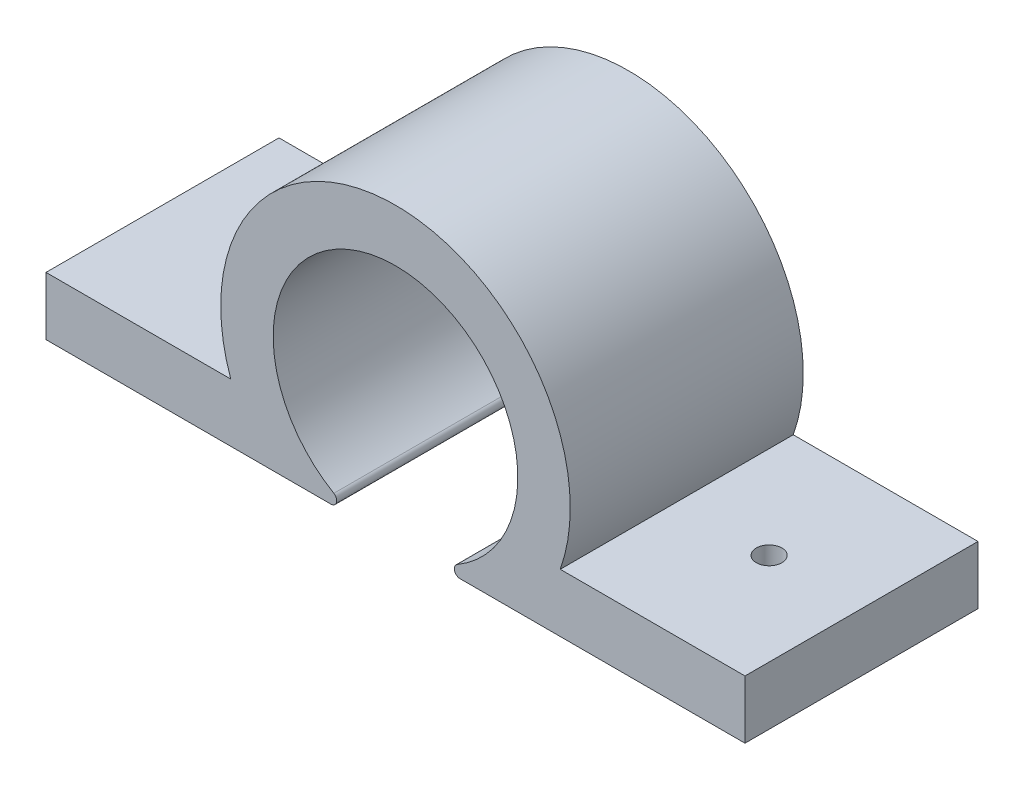
ISO-10303-21;
HEADER;
FILE_DESCRIPTION(('STEP AP214'),'2;1');
FILE_NAME('part.step','',(''),(''),'','','');
FILE_SCHEMA(('AUTOMOTIVE_DESIGN { 1 0 10303 214 1 1 1 1 }'));
ENDSEC;
DATA;
#1=APPLICATION_CONTEXT('core data for automotive mechanical design processes');
#2=APPLICATION_PROTOCOL_DEFINITION('international standard','automotive_design',2000,#1);
#3=PRODUCT_CONTEXT('',#1,'mechanical');
#4=PRODUCT('Part','Part','',(#3));
#5=PRODUCT_RELATED_PRODUCT_CATEGORY('part','',(#4));
#6=PRODUCT_DEFINITION_FORMATION('','',#4);
#7=PRODUCT_DEFINITION_CONTEXT('part definition',#1,'design');
#8=PRODUCT_DEFINITION('design','',#6,#7);
#9=PRODUCT_DEFINITION_SHAPE('','',#8);
#10=(LENGTH_UNIT() NAMED_UNIT(*) SI_UNIT(.MILLI.,.METRE.));
#11=(NAMED_UNIT(*) PLANE_ANGLE_UNIT() SI_UNIT($,.RADIAN.));
#12=(NAMED_UNIT(*) SI_UNIT($,.STERADIAN.) SOLID_ANGLE_UNIT());
#13=UNCERTAINTY_MEASURE_WITH_UNIT(LENGTH_MEASURE(1.E-05),#10,'distance_accuracy_value','');
#14=(GEOMETRIC_REPRESENTATION_CONTEXT(3) GLOBAL_UNCERTAINTY_ASSIGNED_CONTEXT((#13)) GLOBAL_UNIT_ASSIGNED_CONTEXT((#10,
#11,#12)) REPRESENTATION_CONTEXT('',''));
#15=CARTESIAN_POINT('',(0.,0.,0.));
#16=DIRECTION('',(0.,0.,1.));
#17=DIRECTION('',(1.,0.,0.));
#18=AXIS2_PLACEMENT_3D('',#15,#16,#17);
#19=CARTESIAN_POINT('',(-30.,-2.5,20.));
#20=DIRECTION('',(0.,1.,0.));
#21=DIRECTION('',(0.,0.,1.));
#22=AXIS2_PLACEMENT_3D('',#19,#20,#21);
#23=PLANE('',#22);
#24=CARTESIAN_POINT('',(-22.0710678118655,-2.5,10.));
#25=DIRECTION('',(0.,1.,0.));
#26=DIRECTION('',(0.,0.,1.));
#27=AXIS2_PLACEMENT_3D('',#24,#25,#26);
#28=CIRCLE('',#27,1.1);
#29=CARTESIAN_POINT('',(-22.0710678118655,-2.5,11.1));
#30=VERTEX_POINT('',#29);
#31=EDGE_CURVE('E246',#30,#30,#28,.F.);
#32=ORIENTED_EDGE('',*,*,#31,.F.);
#33=EDGE_LOOP('',(#32));
#34=FACE_BOUND('',#33,.T.);
#35=DIRECTION('',(1.,0.,0.));
#36=VECTOR('',#35,1.);
#37=CARTESIAN_POINT('',(-30.,-2.5,0.));
#38=LINE('',#37,#36);
#39=CARTESIAN_POINT('',(-30.,-2.5,0.));
#40=VERTEX_POINT('',#39);
#41=CARTESIAN_POINT('',(-5.54526825320472,-2.5,0.));
#42=VERTEX_POINT('',#41);
#43=EDGE_CURVE('E137',#40,#42,#38,.T.);
#44=ORIENTED_EDGE('',*,*,#43,.T.);
#45=DIRECTION('',(0.,0.,1.));
#46=VECTOR('',#45,1.);
#47=CARTESIAN_POINT('',(-5.54526825320471,-2.5,20.));
#48=LINE('',#47,#46);
#49=CARTESIAN_POINT('',(-5.54526825320472,-2.5,20.));
#50=VERTEX_POINT('',#49);
#51=EDGE_CURVE('E11',#42,#50,#48,.T.);
#52=ORIENTED_EDGE('',*,*,#51,.T.);
#53=DIRECTION('',(1.,0.,0.));
#54=VECTOR('',#53,1.);
#55=CARTESIAN_POINT('',(-30.,-2.5,20.));
#56=LINE('',#55,#54);
#57=CARTESIAN_POINT('',(-30.,-2.5,20.));
#58=VERTEX_POINT('',#57);
#59=EDGE_CURVE('E181',#58,#50,#56,.T.);
#60=ORIENTED_EDGE('',*,*,#59,.F.);
#61=DIRECTION('',(0.,0.,-1.));
#62=VECTOR('',#61,1.);
#63=CARTESIAN_POINT('',(-30.,-2.5,20.));
#64=LINE('',#63,#62);
#65=EDGE_CURVE('E199',#58,#40,#64,.T.);
#66=ORIENTED_EDGE('',*,*,#65,.T.);
#67=EDGE_LOOP('',(#44,#52,#60,#66));
#68=FACE_BOUND('',#67,.T.);
#69=ADVANCED_FACE('F38',(#34,#68),#23,.F.);
#70=CARTESIAN_POINT('',(30.,2.5,20.));
#71=DIRECTION('',(-1.,0.,0.));
#72=DIRECTION('',(0.,-1.,0.));
#73=AXIS2_PLACEMENT_3D('',#70,#71,#72);
#74=PLANE('',#73);
#75=DIRECTION('',(0.,1.,0.));
#76=VECTOR('',#75,1.);
#77=CARTESIAN_POINT('',(30.,2.5,0.));
#78=LINE('',#77,#76);
#79=CARTESIAN_POINT('',(30.,-2.5,0.));
#80=VERTEX_POINT('',#79);
#81=CARTESIAN_POINT('',(30.,2.5,0.));
#82=VERTEX_POINT('',#81);
#83=EDGE_CURVE('E141',#80,#82,#78,.T.);
#84=ORIENTED_EDGE('',*,*,#83,.T.);
#85=DIRECTION('',(0.,0.,-1.));
#86=VECTOR('',#85,1.);
#87=CARTESIAN_POINT('',(30.,2.5,20.));
#88=LINE('',#87,#86);
#89=CARTESIAN_POINT('',(30.,2.5,20.));
#90=VERTEX_POINT('',#89);
#91=EDGE_CURVE('E120',#90,#82,#88,.T.);
#92=ORIENTED_EDGE('',*,*,#91,.F.);
#93=DIRECTION('',(0.,1.,0.));
#94=VECTOR('',#93,1.);
#95=CARTESIAN_POINT('',(30.,2.5,20.));
#96=LINE('',#95,#94);
#97=CARTESIAN_POINT('',(30.,-2.5,20.));
#98=VERTEX_POINT('',#97);
#99=EDGE_CURVE('E127',#98,#90,#96,.T.);
#100=ORIENTED_EDGE('',*,*,#99,.F.);
#101=DIRECTION('',(0.,0.,-1.));
#102=VECTOR('',#101,1.);
#103=CARTESIAN_POINT('',(30.,-2.5,20.));
#104=LINE('',#103,#102);
#105=EDGE_CURVE('E179',#98,#80,#104,.T.);
#106=ORIENTED_EDGE('',*,*,#105,.T.);
#107=EDGE_LOOP('',(#84,#92,#100,#106));
#108=FACE_BOUND('',#107,.T.);
#109=ADVANCED_FACE('F139',(#108),#74,.F.);
#110=CARTESIAN_POINT('',(14.142135623731,2.50000000000001,20.));
#111=DIRECTION('',(0.,-1.,0.));
#112=DIRECTION('',(1.,0.,0.));
#113=AXIS2_PLACEMENT_3D('',#110,#111,#112);
#114=PLANE('',#113);
#115=CARTESIAN_POINT('',(22.0710678118655,2.50000000000001,10.));
#116=DIRECTION('',(0.,1.,0.));
#117=DIRECTION('',(0.,0.,1.));
#118=AXIS2_PLACEMENT_3D('',#115,#116,#117);
#119=CIRCLE('',#118,1.1);
#120=CARTESIAN_POINT('',(22.0710678118655,2.50000000000001,11.1));
#121=VERTEX_POINT('',#120);
#122=EDGE_CURVE('E252',#121,#121,#119,.T.);
#123=ORIENTED_EDGE('',*,*,#122,.F.);
#124=EDGE_LOOP('',(#123));
#125=FACE_BOUND('',#124,.T.);
#126=DIRECTION('',(-1.,0.,0.));
#127=VECTOR('',#126,1.);
#128=CARTESIAN_POINT('',(14.142135623731,2.50000000000001,0.));
#129=LINE('',#128,#127);
#130=CARTESIAN_POINT('',(14.1421356237309,2.5,0.));
#131=VERTEX_POINT('',#130);
#132=EDGE_CURVE('E230',#82,#131,#129,.T.);
#133=ORIENTED_EDGE('',*,*,#132,.T.);
#134=DIRECTION('',(0.,0.,-1.));
#135=VECTOR('',#134,1.);
#136=CARTESIAN_POINT('',(14.1421356237309,2.5,20.));
#137=LINE('',#136,#135);
#138=CARTESIAN_POINT('',(14.1421356237309,2.5,20.));
#139=VERTEX_POINT('',#138);
#140=EDGE_CURVE('E123',#139,#131,#137,.T.);
#141=ORIENTED_EDGE('',*,*,#140,.F.);
#142=DIRECTION('',(-1.,0.,0.));
#143=VECTOR('',#142,1.);
#144=CARTESIAN_POINT('',(14.142135623731,2.50000000000001,20.));
#145=LINE('',#144,#143);
#146=EDGE_CURVE('E116',#90,#139,#145,.T.);
#147=ORIENTED_EDGE('',*,*,#146,.F.);
#148=ORIENTED_EDGE('',*,*,#91,.T.);
#149=EDGE_LOOP('',(#133,#141,#147,#148));
#150=FACE_BOUND('',#149,.T.);
#151=ADVANCED_FACE('F118',(#125,#150),#114,.F.);
#152=CARTESIAN_POINT('',(0.,7.5,20.));
#153=DIRECTION('',(0.,0.,-1.));
#154=DIRECTION('',(-1.,0.,0.));
#155=AXIS2_PLACEMENT_3D('',#152,#153,#154);
#156=CYLINDRICAL_SURFACE('',#155,15.);
#157=CARTESIAN_POINT('',(0.,7.5,0.));
#158=DIRECTION('',(0.,0.,1.));
#159=DIRECTION('',(1.,0.,0.));
#160=AXIS2_PLACEMENT_3D('',#157,#158,#159);
#161=CIRCLE('',#160,15.);
#162=CARTESIAN_POINT('',(-14.142135623731,2.50000000000001,0.));
#163=VERTEX_POINT('',#162);
#164=EDGE_CURVE('E226',#131,#163,#161,.T.);
#165=ORIENTED_EDGE('',*,*,#164,.T.);
#166=DIRECTION('',(0.,0.,-1.));
#167=VECTOR('',#166,1.);
#168=CARTESIAN_POINT('',(-14.142135623731,2.50000000000001,20.));
#169=LINE('',#168,#167);
#170=CARTESIAN_POINT('',(-14.142135623731,2.50000000000001,20.));
#171=VERTEX_POINT('',#170);
#172=EDGE_CURVE('E150',#171,#163,#169,.T.);
#173=ORIENTED_EDGE('',*,*,#172,.F.);
#174=CARTESIAN_POINT('',(0.,7.5,20.));
#175=DIRECTION('',(0.,0.,1.));
#176=DIRECTION('',(1.,0.,0.));
#177=AXIS2_PLACEMENT_3D('',#174,#175,#176);
#178=CIRCLE('',#177,15.);
#179=EDGE_CURVE('E126',#139,#171,#178,.T.);
#180=ORIENTED_EDGE('',*,*,#179,.F.);
#181=ORIENTED_EDGE('',*,*,#140,.T.);
#182=EDGE_LOOP('',(#165,#173,#180,#181));
#183=FACE_BOUND('',#182,.T.);
#184=ADVANCED_FACE('F267',(#183),#156,.T.);
#185=CARTESIAN_POINT('',(-30.,2.5,20.));
#186=DIRECTION('',(0.,-1.,0.));
#187=DIRECTION('',(1.,0.,0.));
#188=AXIS2_PLACEMENT_3D('',#185,#186,#187);
#189=PLANE('',#188);
#190=CARTESIAN_POINT('',(-22.0710678118655,2.50000000000001,10.));
#191=DIRECTION('',(0.,1.,0.));
#192=DIRECTION('',(0.,0.,1.));
#193=AXIS2_PLACEMENT_3D('',#190,#191,#192);
#194=CIRCLE('',#193,1.1);
#195=CARTESIAN_POINT('',(-22.0710678118655,2.50000000000001,11.1));
#196=VERTEX_POINT('',#195);
#197=EDGE_CURVE('E251',#196,#196,#194,.T.);
#198=ORIENTED_EDGE('',*,*,#197,.F.);
#199=EDGE_LOOP('',(#198));
#200=FACE_BOUND('',#199,.T.);
#201=DIRECTION('',(-1.,0.,0.));
#202=VECTOR('',#201,1.);
#203=CARTESIAN_POINT('',(-30.,2.5,0.));
#204=LINE('',#203,#202);
#205=CARTESIAN_POINT('',(-30.,2.5,0.));
#206=VERTEX_POINT('',#205);
#207=EDGE_CURVE('E222',#163,#206,#204,.T.);
#208=ORIENTED_EDGE('',*,*,#207,.T.);
#209=DIRECTION('',(0.,0.,-1.));
#210=VECTOR('',#209,1.);
#211=CARTESIAN_POINT('',(-30.,2.5,20.));
#212=LINE('',#211,#210);
#213=CARTESIAN_POINT('',(-30.,2.5,20.));
#214=VERTEX_POINT('',#213);
#215=EDGE_CURVE('E211',#214,#206,#212,.T.);
#216=ORIENTED_EDGE('',*,*,#215,.F.);
#217=DIRECTION('',(-1.,0.,0.));
#218=VECTOR('',#217,1.);
#219=CARTESIAN_POINT('',(-30.,2.5,20.));
#220=LINE('',#219,#218);
#221=EDGE_CURVE('E223',#171,#214,#220,.T.);
#222=ORIENTED_EDGE('',*,*,#221,.F.);
#223=ORIENTED_EDGE('',*,*,#172,.T.);
#224=EDGE_LOOP('',(#208,#216,#222,#223));
#225=FACE_BOUND('',#224,.T.);
#226=ADVANCED_FACE('F220',(#200,#225),#189,.F.);
#227=CARTESIAN_POINT('',(-30.,2.5,20.));
#228=DIRECTION('',(1.,0.,0.));
#229=DIRECTION('',(0.,1.,0.));
#230=AXIS2_PLACEMENT_3D('',#227,#228,#229);
#231=PLANE('',#230);
#232=DIRECTION('',(0.,-1.,0.));
#233=VECTOR('',#232,1.);
#234=CARTESIAN_POINT('',(-30.,2.5,0.));
#235=LINE('',#234,#233);
#236=EDGE_CURVE('E203',#206,#40,#235,.T.);
#237=ORIENTED_EDGE('',*,*,#236,.T.);
#238=ORIENTED_EDGE('',*,*,#65,.F.);
#239=DIRECTION('',(0.,-1.,0.));
#240=VECTOR('',#239,1.);
#241=CARTESIAN_POINT('',(-30.,2.5,20.));
#242=LINE('',#241,#240);
#243=EDGE_CURVE('E182',#214,#58,#242,.T.);
#244=ORIENTED_EDGE('',*,*,#243,.F.);
#245=ORIENTED_EDGE('',*,*,#215,.T.);
#246=EDGE_LOOP('',(#237,#238,#244,#245));
#247=FACE_BOUND('',#246,.T.);
#248=ADVANCED_FACE('F266',(#247),#231,.F.);
#249=CARTESIAN_POINT('',(22.0710678118655,-2.5,10.));
#250=DIRECTION('',(0.,1.,0.));
#251=DIRECTION('',(0.,0.,1.));
#252=AXIS2_PLACEMENT_3D('',#249,#250,#251);
#253=CIRCLE('',#252,1.1);
#254=CARTESIAN_POINT('',(22.0710678118655,-2.5,11.1));
#255=VERTEX_POINT('',#254);
#256=EDGE_CURVE('E247',#255,#255,#253,.F.);
#257=ORIENTED_EDGE('',*,*,#256,.F.);
#258=EDGE_LOOP('',(#257));
#259=FACE_BOUND('',#258,.T.);
#260=CARTESIAN_POINT('',(5.5452682532047,-2.5,20.));
#261=VERTEX_POINT('',#260);
#262=EDGE_CURVE('E132',#261,#98,#56,.T.);
#263=ORIENTED_EDGE('',*,*,#262,.F.);
#264=DIRECTION('',(0.,0.,1.));
#265=VECTOR('',#264,1.);
#266=CARTESIAN_POINT('',(5.54526825320471,-2.5,20.));
#267=LINE('',#266,#265);
#268=CARTESIAN_POINT('',(5.5452682532047,-2.5,0.));
#269=VERTEX_POINT('',#268);
#270=EDGE_CURVE('E148',#261,#269,#267,.F.);
#271=ORIENTED_EDGE('',*,*,#270,.T.);
#272=EDGE_CURVE('E189',#269,#80,#38,.T.);
#273=ORIENTED_EDGE('',*,*,#272,.T.);
#274=ORIENTED_EDGE('',*,*,#105,.F.);
#275=EDGE_LOOP('',(#263,#271,#273,#274));
#276=FACE_BOUND('',#275,.T.);
#277=ADVANCED_FACE('F177',(#259,#276),#23,.F.);
#278=CARTESIAN_POINT('',(0.,7.5,20.));
#279=DIRECTION('',(0.,0.,1.));
#280=DIRECTION('',(1.,0.,0.));
#281=AXIS2_PLACEMENT_3D('',#278,#279,#280);
#282=PLANE('',#281);
#283=CARTESIAN_POINT('',(0.,7.5,20.));
#284=DIRECTION('',(0.,0.,1.));
#285=DIRECTION('',(1.,0.,0.));
#286=AXIS2_PLACEMENT_3D('',#283,#284,#285);
#287=CIRCLE('',#286,10.5);
#288=CARTESIAN_POINT('',(5.29321060533177,-1.56818181818182,20.));
#289=VERTEX_POINT('',#288);
#290=CARTESIAN_POINT('',(-5.29321060533177,-1.56818181818182,20.));
#291=VERTEX_POINT('',#290);
#292=EDGE_CURVE('E172',#289,#291,#287,.T.);
#293=ORIENTED_EDGE('',*,*,#292,.F.);
#294=CARTESIAN_POINT('',(5.54526825320471,-2.,20.));
#295=DIRECTION('',(0.,0.,1.));
#296=DIRECTION('',(1.,0.,0.));
#297=AXIS2_PLACEMENT_3D('',#294,#295,#296);
#298=CIRCLE('',#297,0.5);
#299=EDGE_CURVE('E47',#289,#261,#298,.T.);
#300=ORIENTED_EDGE('',*,*,#299,.T.);
#301=ORIENTED_EDGE('',*,*,#262,.T.);
#302=ORIENTED_EDGE('',*,*,#99,.T.);
#303=ORIENTED_EDGE('',*,*,#146,.T.);
#304=ORIENTED_EDGE('',*,*,#179,.T.);
#305=ORIENTED_EDGE('',*,*,#221,.T.);
#306=ORIENTED_EDGE('',*,*,#243,.T.);
#307=ORIENTED_EDGE('',*,*,#59,.T.);
#308=CARTESIAN_POINT('',(-5.54526825320471,-2.,20.));
#309=DIRECTION('',(0.,0.,1.));
#310=DIRECTION('',(1.,0.,0.));
#311=AXIS2_PLACEMENT_3D('',#308,#309,#310);
#312=CIRCLE('',#311,0.5);
#313=EDGE_CURVE('E54',#50,#291,#312,.T.);
#314=ORIENTED_EDGE('',*,*,#313,.T.);
#315=EDGE_LOOP('',(#293,#300,#301,#302,#303,#304,#305,#306,#307,#314));
#316=FACE_BOUND('',#315,.T.);
#317=ADVANCED_FACE('F130',(#316),#282,.T.);
#318=CARTESIAN_POINT('',(0.,7.5,0.));
#319=DIRECTION('',(0.,0.,1.));
#320=DIRECTION('',(1.,0.,0.));
#321=AXIS2_PLACEMENT_3D('',#318,#319,#320);
#322=PLANE('',#321);
#323=ORIENTED_EDGE('',*,*,#272,.F.);
#324=CARTESIAN_POINT('',(5.54526825320471,-2.,0.));
#325=DIRECTION('',(0.,0.,1.));
#326=DIRECTION('',(1.,0.,0.));
#327=AXIS2_PLACEMENT_3D('',#324,#325,#326);
#328=CIRCLE('',#327,0.5);
#329=CARTESIAN_POINT('',(5.29321060533177,-1.56818181818182,0.));
#330=VERTEX_POINT('',#329);
#331=EDGE_CURVE('E160',#269,#330,#328,.F.);
#332=ORIENTED_EDGE('',*,*,#331,.T.);
#333=CARTESIAN_POINT('',(0.,7.5,0.));
#334=DIRECTION('',(0.,0.,1.));
#335=DIRECTION('',(1.,0.,0.));
#336=AXIS2_PLACEMENT_3D('',#333,#334,#335);
#337=CIRCLE('',#336,10.5);
#338=CARTESIAN_POINT('',(-5.29321060533177,-1.56818181818182,0.));
#339=VERTEX_POINT('',#338);
#340=EDGE_CURVE('E143',#330,#339,#337,.T.);
#341=ORIENTED_EDGE('',*,*,#340,.T.);
#342=CARTESIAN_POINT('',(-5.54526825320471,-2.,0.));
#343=DIRECTION('',(0.,0.,1.));
#344=DIRECTION('',(1.,0.,0.));
#345=AXIS2_PLACEMENT_3D('',#342,#343,#344);
#346=CIRCLE('',#345,0.5);
#347=EDGE_CURVE('E157',#339,#42,#346,.F.);
#348=ORIENTED_EDGE('',*,*,#347,.T.);
#349=ORIENTED_EDGE('',*,*,#43,.F.);
#350=ORIENTED_EDGE('',*,*,#236,.F.);
#351=ORIENTED_EDGE('',*,*,#207,.F.);
#352=ORIENTED_EDGE('',*,*,#164,.F.);
#353=ORIENTED_EDGE('',*,*,#132,.F.);
#354=ORIENTED_EDGE('',*,*,#83,.F.);
#355=EDGE_LOOP('',(#323,#332,#341,#348,#349,#350,#351,#352,#353,#354));
#356=FACE_BOUND('',#355,.T.);
#357=ADVANCED_FACE('F187',(#356),#322,.F.);
#358=CARTESIAN_POINT('',(0.,7.5,0.));
#359=DIRECTION('',(0.,0.,1.));
#360=DIRECTION('',(1.,0.,0.));
#361=AXIS2_PLACEMENT_3D('',#358,#359,#360);
#362=CYLINDRICAL_SURFACE('',#361,10.5);
#363=ORIENTED_EDGE('',*,*,#340,.F.);
#364=DIRECTION('',(0.,0.,1.));
#365=VECTOR('',#364,1.);
#366=CARTESIAN_POINT('',(5.29321060533177,-1.56818181818182,0.));
#367=LINE('',#366,#365);
#368=EDGE_CURVE('E166',#330,#289,#367,.T.);
#369=ORIENTED_EDGE('',*,*,#368,.T.);
#370=ORIENTED_EDGE('',*,*,#292,.T.);
#371=DIRECTION('',(0.,0.,1.));
#372=VECTOR('',#371,1.);
#373=CARTESIAN_POINT('',(-5.29321060533177,-1.56818181818182,0.));
#374=LINE('',#373,#372);
#375=EDGE_CURVE('E163',#291,#339,#374,.F.);
#376=ORIENTED_EDGE('',*,*,#375,.T.);
#377=EDGE_LOOP('',(#363,#369,#370,#376));
#378=FACE_BOUND('',#377,.T.);
#379=ADVANCED_FACE('F191',(#378),#362,.F.);
#380=CARTESIAN_POINT('',(22.0710678118655,-5.61126983722081,10.));
#381=DIRECTION('',(0.,1.,0.));
#382=DIRECTION('',(0.,0.,1.));
#383=AXIS2_PLACEMENT_3D('',#380,#381,#382);
#384=CYLINDRICAL_SURFACE('',#383,1.1);
#385=ORIENTED_EDGE('',*,*,#256,.T.);
#386=EDGE_LOOP('',(#385));
#387=FACE_BOUND('',#386,.T.);
#388=ORIENTED_EDGE('',*,*,#122,.T.);
#389=EDGE_LOOP('',(#388));
#390=FACE_BOUND('',#389,.T.);
#391=ADVANCED_FACE('F294',(#387,#390),#384,.F.);
#392=CARTESIAN_POINT('',(-22.0710678118655,-5.61126983722081,10.));
#393=DIRECTION('',(0.,1.,0.));
#394=DIRECTION('',(0.,0.,1.));
#395=AXIS2_PLACEMENT_3D('',#392,#393,#394);
#396=CYLINDRICAL_SURFACE('',#395,1.1);
#397=ORIENTED_EDGE('',*,*,#31,.T.);
#398=EDGE_LOOP('',(#397));
#399=FACE_BOUND('',#398,.T.);
#400=ORIENTED_EDGE('',*,*,#197,.T.);
#401=EDGE_LOOP('',(#400));
#402=FACE_BOUND('',#401,.T.);
#403=ADVANCED_FACE('F263',(#399,#402),#396,.F.);
#404=CARTESIAN_POINT('',(5.54526825320471,-2.,0.));
#405=DIRECTION('',(0.,0.,1.));
#406=DIRECTION('',(1.,0.,0.));
#407=AXIS2_PLACEMENT_3D('',#404,#405,#406);
#408=CYLINDRICAL_SURFACE('',#407,0.5);
#409=ORIENTED_EDGE('',*,*,#299,.F.);
#410=ORIENTED_EDGE('',*,*,#368,.F.);
#411=ORIENTED_EDGE('',*,*,#331,.F.);
#412=ORIENTED_EDGE('',*,*,#270,.F.);
#413=EDGE_LOOP('',(#409,#410,#411,#412));
#414=FACE_BOUND('',#413,.T.);
#415=ADVANCED_FACE('F184',(#414),#408,.T.);
#416=CARTESIAN_POINT('',(-5.54526825320471,-2.,0.));
#417=DIRECTION('',(0.,0.,1.));
#418=DIRECTION('',(1.,0.,0.));
#419=AXIS2_PLACEMENT_3D('',#416,#417,#418);
#420=CYLINDRICAL_SURFACE('',#419,0.5);
#421=ORIENTED_EDGE('',*,*,#347,.F.);
#422=ORIENTED_EDGE('',*,*,#375,.F.);
#423=ORIENTED_EDGE('',*,*,#313,.F.);
#424=ORIENTED_EDGE('',*,*,#51,.F.);
#425=EDGE_LOOP('',(#421,#422,#423,#424));
#426=FACE_BOUND('',#425,.T.);
#427=ADVANCED_FACE('F40',(#426),#420,.T.);
#428=CLOSED_SHELL('',(#69,#109,#151,#184,#226,#248,#277,#317,#357,#379,#391,#403,#415,#427));
#429=MANIFOLD_SOLID_BREP('B2',#428);
#430=ADVANCED_BREP_SHAPE_REPRESENTATION('',(#18,#429),#14);
#431=SHAPE_DEFINITION_REPRESENTATION(#9,#430);
ENDSEC;
END-ISO-10303-21;
